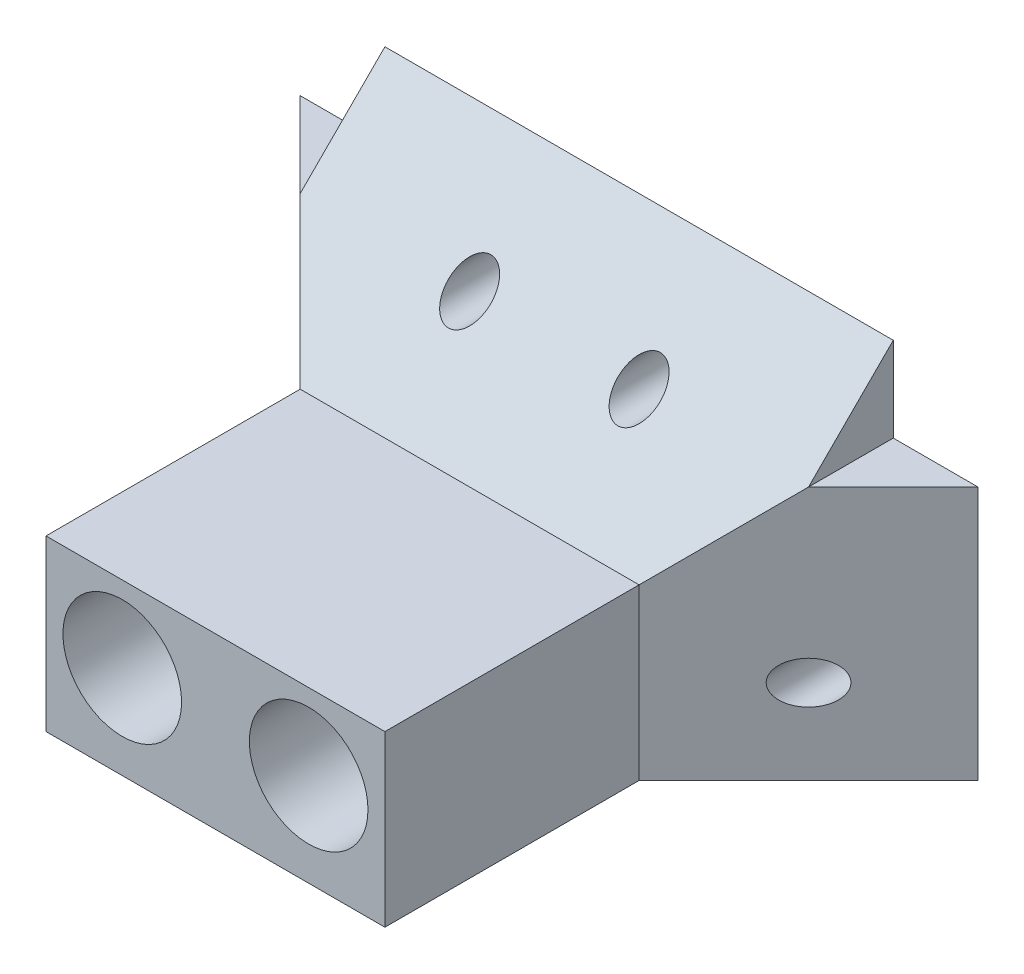
ISO-10303-21;
HEADER;
FILE_DESCRIPTION(('STEP AP214'),'2;1');
FILE_NAME('part.step','',(''),(''),'','','');
FILE_SCHEMA(('AUTOMOTIVE_DESIGN { 1 0 10303 214 1 1 1 1 }'));
ENDSEC;
DATA;
#1=APPLICATION_CONTEXT('core data for automotive mechanical design processes');
#2=APPLICATION_PROTOCOL_DEFINITION('international standard','automotive_design',2000,#1);
#3=PRODUCT_CONTEXT('',#1,'mechanical');
#4=PRODUCT('Part','Part','',(#3));
#5=PRODUCT_RELATED_PRODUCT_CATEGORY('part','',(#4));
#6=PRODUCT_DEFINITION_FORMATION('','',#4);
#7=PRODUCT_DEFINITION_CONTEXT('part definition',#1,'design');
#8=PRODUCT_DEFINITION('design','',#6,#7);
#9=PRODUCT_DEFINITION_SHAPE('','',#8);
#10=(LENGTH_UNIT() NAMED_UNIT(*) SI_UNIT(.MILLI.,.METRE.));
#11=(NAMED_UNIT(*) PLANE_ANGLE_UNIT() SI_UNIT($,.RADIAN.));
#12=(NAMED_UNIT(*) SI_UNIT($,.STERADIAN.) SOLID_ANGLE_UNIT());
#13=UNCERTAINTY_MEASURE_WITH_UNIT(LENGTH_MEASURE(1.E-05),#10,'distance_accuracy_value','');
#14=(GEOMETRIC_REPRESENTATION_CONTEXT(3) GLOBAL_UNCERTAINTY_ASSIGNED_CONTEXT((#13)) GLOBAL_UNIT_ASSIGNED_CONTEXT((#10,
#11,#12)) REPRESENTATION_CONTEXT('',''));
#15=CARTESIAN_POINT('',(0.,0.,0.));
#16=DIRECTION('',(0.,0.,1.));
#17=DIRECTION('',(1.,0.,0.));
#18=AXIS2_PLACEMENT_3D('',#15,#16,#17);
#19=CARTESIAN_POINT('',(14.9999999999999,20.0000000000001,15.));
#20=DIRECTION('',(0.,-0.707106781186547,-0.707106781186548));
#21=DIRECTION('',(0.,0.707106781186548,-0.707106781186547));
#22=AXIS2_PLACEMENT_3D('',#19,#20,#21);
#23=PLANE('',#22);
#24=CARTESIAN_POINT('',(4.99999999999995,15.,20.));
#25=DIRECTION('',(0.,-0.707106781186547,-0.707106781186548));
#26=DIRECTION('',(0.,0.707106781186548,-0.707106781186547));
#27=AXIS2_PLACEMENT_3D('',#24,#25,#26);
#28=ELLIPSE('',#27,1.76776695296637,1.25);
#29=CARTESIAN_POINT('',(4.99999999999994,16.25,18.75));
#30=VERTEX_POINT('',#29);
#31=EDGE_CURVE('E243',#30,#30,#28,.T.);
#32=ORIENTED_EDGE('',*,*,#31,.T.);
#33=EDGE_LOOP('',(#32));
#34=FACE_BOUND('',#33,.T.);
#35=CARTESIAN_POINT('',(-5.00000000000005,15.,20.));
#36=DIRECTION('',(0.,-0.707106781186547,-0.707106781186548));
#37=DIRECTION('',(0.,0.707106781186548,-0.707106781186547));
#38=AXIS2_PLACEMENT_3D('',#35,#36,#37);
#39=ELLIPSE('',#38,1.76776695296637,1.25);
#40=CARTESIAN_POINT('',(-5.00000000000005,16.25,18.75));
#41=VERTEX_POINT('',#40);
#42=EDGE_CURVE('E246',#41,#41,#39,.T.);
#43=ORIENTED_EDGE('',*,*,#42,.T.);
#44=EDGE_LOOP('',(#43));
#45=FACE_BOUND('',#44,.T.);
#46=DIRECTION('',(-0.577350269189624,-0.577350269189628,0.577350269189626));
#47=VECTOR('',#46,1.);
#48=CARTESIAN_POINT('',(18.3333333333332,18.3333333333334,16.6666666666667));
#49=LINE('',#48,#47);
#50=CARTESIAN_POINT('',(15.,15.,20.0000000000001));
#51=VERTEX_POINT('',#50);
#52=CARTESIAN_POINT('',(9.99999999999992,10.,25.));
#53=VERTEX_POINT('',#52);
#54=EDGE_CURVE('E547',#51,#53,#49,.T.);
#55=ORIENTED_EDGE('',*,*,#54,.F.);
#56=DIRECTION('',(0.,-0.707106781186548,0.707106781186547));
#57=VECTOR('',#56,1.);
#58=CARTESIAN_POINT('',(14.9999999999999,20.0000000000001,15.));
#59=LINE('',#58,#57);
#60=CARTESIAN_POINT('',(14.9999999999999,20.0000000000001,15.));
#61=VERTEX_POINT('',#60);
#62=EDGE_CURVE('E161',#61,#51,#59,.T.);
#63=ORIENTED_EDGE('',*,*,#62,.F.);
#64=DIRECTION('',(-1.,0.,0.));
#65=VECTOR('',#64,1.);
#66=CARTESIAN_POINT('',(-15.0000000000001,19.9999999999999,15.));
#67=LINE('',#66,#65);
#68=CARTESIAN_POINT('',(-15.0000000000001,20.,15.));
#69=VERTEX_POINT('',#68);
#70=EDGE_CURVE('E169',#61,#69,#67,.T.);
#71=ORIENTED_EDGE('',*,*,#70,.T.);
#72=DIRECTION('',(0.,-0.707106781186548,0.707106781186547));
#73=VECTOR('',#72,1.);
#74=CARTESIAN_POINT('',(-15.0000000000001,20.,15.));
#75=LINE('',#74,#73);
#76=CARTESIAN_POINT('',(-15.,15.,20.));
#77=VERTEX_POINT('',#76);
#78=EDGE_CURVE('E164',#69,#77,#75,.T.);
#79=ORIENTED_EDGE('',*,*,#78,.T.);
#80=DIRECTION('',(0.577350269189627,-0.577350269189625,0.577350269189626));
#81=VECTOR('',#80,1.);
#82=CARTESIAN_POINT('',(-8.33333333333337,8.33333333333334,26.6666666666666));
#83=LINE('',#82,#81);
#84=CARTESIAN_POINT('',(-10.,9.99999999999997,25.));
#85=VERTEX_POINT('',#84);
#86=EDGE_CURVE('E250',#77,#85,#83,.T.);
#87=ORIENTED_EDGE('',*,*,#86,.T.);
#88=DIRECTION('',(1.,0.,0.));
#89=VECTOR('',#88,1.);
#90=CARTESIAN_POINT('',(-15.,9.99999999999995,25.));
#91=LINE('',#90,#89);
#92=EDGE_CURVE('E168',#85,#53,#91,.T.);
#93=ORIENTED_EDGE('',*,*,#92,.T.);
#94=EDGE_LOOP('',(#55,#63,#71,#79,#87,#93));
#95=FACE_BOUND('',#94,.T.);
#96=ADVANCED_FACE('F41',(#34,#45,#95),#23,.F.);
#97=CARTESIAN_POINT('',(14.9999999999999,20.0000000000001,15.));
#98=DIRECTION('',(-1.,0.,0.));
#99=DIRECTION('',(0.,-1.,0.));
#100=AXIS2_PLACEMENT_3D('',#97,#98,#99);
#101=PLANE('',#100);
#102=DIRECTION('',(0.,-1.,0.));
#103=VECTOR('',#102,1.);
#104=CARTESIAN_POINT('',(14.9999999999999,20.0000000000001,15.));
#105=LINE('',#104,#103);
#106=CARTESIAN_POINT('',(14.9999999999999,15.,15.));
#107=VERTEX_POINT('',#106);
#108=EDGE_CURVE('E171',#61,#107,#105,.T.);
#109=ORIENTED_EDGE('',*,*,#108,.F.);
#110=ORIENTED_EDGE('',*,*,#62,.T.);
#111=DIRECTION('',(0.,0.,-1.));
#112=VECTOR('',#111,1.);
#113=CARTESIAN_POINT('',(14.9999999999999,15.,15.));
#114=LINE('',#113,#112);
#115=EDGE_CURVE('E179',#51,#107,#114,.T.);
#116=ORIENTED_EDGE('',*,*,#115,.T.);
#117=EDGE_LOOP('',(#109,#110,#116));
#118=FACE_BOUND('',#117,.T.);
#119=ADVANCED_FACE('F285',(#118),#101,.F.);
#120=CARTESIAN_POINT('',(-10.,10.,40.));
#121=DIRECTION('',(0.,-1.,0.));
#122=DIRECTION('',(0.,0.,-1.));
#123=AXIS2_PLACEMENT_3D('',#120,#121,#122);
#124=PLANE('',#123);
#125=ORIENTED_EDGE('',*,*,#92,.F.);
#126=DIRECTION('',(0.,0.,-1.));
#127=VECTOR('',#126,1.);
#128=CARTESIAN_POINT('',(-10.,10.,40.));
#129=LINE('',#128,#127);
#130=CARTESIAN_POINT('',(-10.,10.,40.));
#131=VERTEX_POINT('',#130);
#132=EDGE_CURVE('E231',#131,#85,#129,.T.);
#133=ORIENTED_EDGE('',*,*,#132,.F.);
#134=DIRECTION('',(-1.,0.,0.));
#135=VECTOR('',#134,1.);
#136=CARTESIAN_POINT('',(-10.,10.,40.));
#137=LINE('',#136,#135);
#138=CARTESIAN_POINT('',(10.,10.,40.));
#139=VERTEX_POINT('',#138);
#140=EDGE_CURVE('E63',#139,#131,#137,.T.);
#141=ORIENTED_EDGE('',*,*,#140,.F.);
#142=DIRECTION('',(0.,0.,-1.));
#143=VECTOR('',#142,1.);
#144=CARTESIAN_POINT('',(10.,10.,40.));
#145=LINE('',#144,#143);
#146=EDGE_CURVE('E234',#139,#53,#145,.T.);
#147=ORIENTED_EDGE('',*,*,#146,.T.);
#148=EDGE_LOOP('',(#125,#133,#141,#147));
#149=FACE_BOUND('',#148,.T.);
#150=ADVANCED_FACE('F290',(#149),#124,.F.);
#151=CARTESIAN_POINT('',(-10.,10.,40.));
#152=DIRECTION('',(1.,0.,0.));
#153=DIRECTION('',(0.,0.,-1.));
#154=AXIS2_PLACEMENT_3D('',#151,#152,#153);
#155=PLANE('',#154);
#156=DIRECTION('',(0.,1.,0.));
#157=VECTOR('',#156,1.);
#158=CARTESIAN_POINT('',(-10.,-15.,25.));
#159=LINE('',#158,#157);
#160=CARTESIAN_POINT('',(-10.,0.,25.));
#161=VERTEX_POINT('',#160);
#162=EDGE_CURVE('E157',#161,#85,#159,.T.);
#163=ORIENTED_EDGE('',*,*,#162,.F.);
#164=DIRECTION('',(0.,0.,1.));
#165=VECTOR('',#164,1.);
#166=CARTESIAN_POINT('',(-10.,0.,40.));
#167=LINE('',#166,#165);
#168=CARTESIAN_POINT('',(-10.,0.,40.));
#169=VERTEX_POINT('',#168);
#170=EDGE_CURVE('E56',#161,#169,#167,.T.);
#171=ORIENTED_EDGE('',*,*,#170,.T.);
#172=DIRECTION('',(0.,-1.,0.));
#173=VECTOR('',#172,1.);
#174=CARTESIAN_POINT('',(-10.,10.,40.));
#175=LINE('',#174,#173);
#176=EDGE_CURVE('E229',#131,#169,#175,.T.);
#177=ORIENTED_EDGE('',*,*,#176,.F.);
#178=ORIENTED_EDGE('',*,*,#132,.T.);
#179=EDGE_LOOP('',(#163,#171,#177,#178));
#180=FACE_BOUND('',#179,.T.);
#181=ADVANCED_FACE('F414',(#180),#155,.F.);
#182=CARTESIAN_POINT('',(20.,15.,15.));
#183=DIRECTION('',(0.,-1.,0.));
#184=DIRECTION('',(1.,0.,0.));
#185=AXIS2_PLACEMENT_3D('',#182,#183,#184);
#186=PLANE('',#185);
#187=ORIENTED_EDGE('',*,*,#115,.F.);
#188=DIRECTION('',(-0.707106781186548,0.,0.707106781186547));
#189=VECTOR('',#188,1.);
#190=CARTESIAN_POINT('',(20.,15.,15.));
#191=LINE('',#190,#189);
#192=CARTESIAN_POINT('',(20.,15.,15.));
#193=VERTEX_POINT('',#192);
#194=EDGE_CURVE('E185',#193,#51,#191,.T.);
#195=ORIENTED_EDGE('',*,*,#194,.F.);
#196=DIRECTION('',(-1.,0.,0.));
#197=VECTOR('',#196,1.);
#198=CARTESIAN_POINT('',(20.,15.,15.));
#199=LINE('',#198,#197);
#200=EDGE_CURVE('E190',#193,#107,#199,.T.);
#201=ORIENTED_EDGE('',*,*,#200,.T.);
#202=EDGE_LOOP('',(#187,#195,#201));
#203=FACE_BOUND('',#202,.T.);
#204=ADVANCED_FACE('F406',(#203),#186,.F.);
#205=CARTESIAN_POINT('',(20.,-15.,15.));
#206=DIRECTION('',(-0.707106781186547,0.,-0.707106781186548));
#207=DIRECTION('',(-0.707106781186548,0.,0.707106781186547));
#208=AXIS2_PLACEMENT_3D('',#205,#206,#207);
#209=PLANE('',#208);
#210=CARTESIAN_POINT('',(15.,5.,20.));
#211=DIRECTION('',(-0.707106781186547,0.,-0.707106781186548));
#212=DIRECTION('',(0.707106781186548,0.,-0.707106781186547));
#213=AXIS2_PLACEMENT_3D('',#210,#211,#212);
#214=ELLIPSE('',#213,1.76776695296637,1.25);
#215=CARTESIAN_POINT('',(16.25,5.,18.75));
#216=VERTEX_POINT('',#215);
#217=EDGE_CURVE('E184',#216,#216,#214,.T.);
#218=ORIENTED_EDGE('',*,*,#217,.T.);
#219=EDGE_LOOP('',(#218));
#220=FACE_BOUND('',#219,.T.);
#221=DIRECTION('',(0.,-1.,0.));
#222=VECTOR('',#221,1.);
#223=CARTESIAN_POINT('',(10.,15.,25.));
#224=LINE('',#223,#222);
#225=CARTESIAN_POINT('',(10.,0.,25.));
#226=VERTEX_POINT('',#225);
#227=EDGE_CURVE('E49',#53,#226,#224,.T.);
#228=ORIENTED_EDGE('',*,*,#227,.T.);
#229=DIRECTION('',(0.707106781186548,0.,-0.707106781186547));
#230=VECTOR('',#229,1.);
#231=CARTESIAN_POINT('',(20.,0.,15.));
#232=LINE('',#231,#230);
#233=CARTESIAN_POINT('',(20.,0.,15.));
#234=VERTEX_POINT('',#233);
#235=EDGE_CURVE('E548',#226,#234,#232,.T.);
#236=ORIENTED_EDGE('',*,*,#235,.T.);
#237=DIRECTION('',(0.,1.,0.));
#238=VECTOR('',#237,1.);
#239=CARTESIAN_POINT('',(20.,15.,15.));
#240=LINE('',#239,#238);
#241=EDGE_CURVE('E188',#234,#193,#240,.T.);
#242=ORIENTED_EDGE('',*,*,#241,.T.);
#243=ORIENTED_EDGE('',*,*,#194,.T.);
#244=ORIENTED_EDGE('',*,*,#54,.T.);
#245=EDGE_LOOP('',(#228,#236,#242,#243,#244));
#246=FACE_BOUND('',#245,.T.);
#247=ADVANCED_FACE('F397',(#220,#246),#209,.F.);
#248=CARTESIAN_POINT('',(10.,10.,40.));
#249=DIRECTION('',(-1.,0.,0.));
#250=DIRECTION('',(0.,-1.,0.));
#251=AXIS2_PLACEMENT_3D('',#248,#249,#250);
#252=PLANE('',#251);
#253=DIRECTION('',(0.,1.,0.));
#254=VECTOR('',#253,1.);
#255=CARTESIAN_POINT('',(10.,10.,40.));
#256=LINE('',#255,#254);
#257=CARTESIAN_POINT('',(10.,0.,40.));
#258=VERTEX_POINT('',#257);
#259=EDGE_CURVE('E226',#258,#139,#256,.T.);
#260=ORIENTED_EDGE('',*,*,#259,.F.);
#261=DIRECTION('',(0.,0.,-1.));
#262=VECTOR('',#261,1.);
#263=CARTESIAN_POINT('',(10.,0.,40.));
#264=LINE('',#263,#262);
#265=EDGE_CURVE('E551',#258,#226,#264,.T.);
#266=ORIENTED_EDGE('',*,*,#265,.T.);
#267=ORIENTED_EDGE('',*,*,#227,.F.);
#268=ORIENTED_EDGE('',*,*,#146,.F.);
#269=EDGE_LOOP('',(#260,#266,#267,#268));
#270=FACE_BOUND('',#269,.T.);
#271=ADVANCED_FACE('F43',(#270),#252,.F.);
#272=CARTESIAN_POINT('',(2.92893218813453,0.,0.));
#273=DIRECTION('',(1.,0.,0.));
#274=DIRECTION('',(0.,0.,-1.));
#275=AXIS2_PLACEMENT_3D('',#272,#273,#274);
#276=PLANE('',#275);
#277=DIRECTION('',(0.,0.,1.));
#278=VECTOR('',#277,1.);
#279=CARTESIAN_POINT('',(2.92893218813453,0.,0.));
#280=LINE('',#279,#278);
#281=CARTESIAN_POINT('',(2.92893218813453,0.,10.));
#282=VERTEX_POINT('',#281);
#283=CARTESIAN_POINT('',(2.92893218813453,0.,15.));
#284=VERTEX_POINT('',#283);
#285=EDGE_CURVE('E541',#282,#284,#280,.T.);
#286=ORIENTED_EDGE('',*,*,#285,.F.);
#287=DIRECTION('',(0.,-1.,0.));
#288=VECTOR('',#287,1.);
#289=CARTESIAN_POINT('',(2.92893218813453,2.92893218813454,10.));
#290=LINE('',#289,#288);
#291=CARTESIAN_POINT('',(2.92893218813453,2.92893218813454,10.));
#292=VERTEX_POINT('',#291);
#293=EDGE_CURVE('E196',#292,#282,#290,.T.);
#294=ORIENTED_EDGE('',*,*,#293,.F.);
#295=DIRECTION('',(0.,0.,1.));
#296=VECTOR('',#295,1.);
#297=CARTESIAN_POINT('',(2.92893218813453,2.92893218813454,0.));
#298=LINE('',#297,#296);
#299=CARTESIAN_POINT('',(2.92893218813453,2.92893218813454,15.));
#300=VERTEX_POINT('',#299);
#301=EDGE_CURVE('E193',#292,#300,#298,.T.);
#302=ORIENTED_EDGE('',*,*,#301,.T.);
#303=DIRECTION('',(0.,-1.,0.));
#304=VECTOR('',#303,1.);
#305=CARTESIAN_POINT('',(2.92893218813453,7.5,15.));
#306=LINE('',#305,#304);
#307=EDGE_CURVE('E223',#300,#284,#306,.T.);
#308=ORIENTED_EDGE('',*,*,#307,.T.);
#309=EDGE_LOOP('',(#286,#294,#302,#308));
#310=FACE_BOUND('',#309,.T.);
#311=ADVANCED_FACE('F384',(#310),#276,.T.);
#312=CARTESIAN_POINT('',(0.,2.92893218813453,0.));
#313=DIRECTION('',(0.,1.,0.));
#314=DIRECTION('',(0.,0.,-1.));
#315=AXIS2_PLACEMENT_3D('',#312,#313,#314);
#316=PLANE('',#315);
#317=ORIENTED_EDGE('',*,*,#301,.F.);
#318=DIRECTION('',(1.,0.,0.));
#319=VECTOR('',#318,1.);
#320=CARTESIAN_POINT('',(2.92893218813453,2.92893218813454,10.));
#321=LINE('',#320,#319);
#322=CARTESIAN_POINT('',(-2.92893218813453,2.92893218813454,10.));
#323=VERTEX_POINT('',#322);
#324=EDGE_CURVE('E199',#323,#292,#321,.T.);
#325=ORIENTED_EDGE('',*,*,#324,.F.);
#326=DIRECTION('',(0.,0.,1.));
#327=VECTOR('',#326,1.);
#328=CARTESIAN_POINT('',(-2.92893218813453,2.92893218813452,0.));
#329=LINE('',#328,#327);
#330=CARTESIAN_POINT('',(-2.92893218813453,2.92893218813452,15.));
#331=VERTEX_POINT('',#330);
#332=EDGE_CURVE('E220',#323,#331,#329,.T.);
#333=ORIENTED_EDGE('',*,*,#332,.T.);
#334=DIRECTION('',(1.,0.,0.));
#335=VECTOR('',#334,1.);
#336=CARTESIAN_POINT('',(-7.50000000000001,2.9289321881345,15.));
#337=LINE('',#336,#335);
#338=EDGE_CURVE('E217',#331,#300,#337,.T.);
#339=ORIENTED_EDGE('',*,*,#338,.T.);
#340=EDGE_LOOP('',(#317,#325,#333,#339));
#341=FACE_BOUND('',#340,.T.);
#342=ADVANCED_FACE('F375',(#341),#316,.T.);
#343=CARTESIAN_POINT('',(-2.92893218813453,0.,0.));
#344=DIRECTION('',(-1.,0.,0.));
#345=DIRECTION('',(0.,0.,-1.));
#346=AXIS2_PLACEMENT_3D('',#343,#344,#345);
#347=PLANE('',#346);
#348=DIRECTION('',(0.,0.,-1.));
#349=VECTOR('',#348,1.);
#350=CARTESIAN_POINT('',(-2.92893218813453,0.,0.));
#351=LINE('',#350,#349);
#352=CARTESIAN_POINT('',(-2.92893218813453,0.,15.));
#353=VERTEX_POINT('',#352);
#354=CARTESIAN_POINT('',(-2.92893218813453,0.,10.));
#355=VERTEX_POINT('',#354);
#356=EDGE_CURVE('E149',#353,#355,#351,.T.);
#357=ORIENTED_EDGE('',*,*,#356,.F.);
#358=DIRECTION('',(0.,1.,0.));
#359=VECTOR('',#358,1.);
#360=CARTESIAN_POINT('',(-2.92893218813453,-7.5,15.));
#361=LINE('',#360,#359);
#362=EDGE_CURVE('E148',#353,#331,#361,.T.);
#363=ORIENTED_EDGE('',*,*,#362,.T.);
#364=ORIENTED_EDGE('',*,*,#332,.F.);
#365=DIRECTION('',(0.,-1.,0.));
#366=VECTOR('',#365,1.);
#367=CARTESIAN_POINT('',(-2.92893218813453,0.,10.));
#368=LINE('',#367,#366);
#369=EDGE_CURVE('E201',#323,#355,#368,.T.);
#370=ORIENTED_EDGE('',*,*,#369,.T.);
#371=EDGE_LOOP('',(#357,#363,#364,#370));
#372=FACE_BOUND('',#371,.T.);
#373=ADVANCED_FACE('F364',(#372),#347,.T.);
#374=CARTESIAN_POINT('',(0.,0.,40.));
#375=DIRECTION('',(0.,0.,1.));
#376=DIRECTION('',(1.,0.,0.));
#377=AXIS2_PLACEMENT_3D('',#374,#375,#376);
#378=PLANE('',#377);
#379=DIRECTION('',(-1.,0.,0.));
#380=VECTOR('',#379,1.);
#381=CARTESIAN_POINT('',(0.,0.,40.));
#382=LINE('',#381,#380);
#383=EDGE_CURVE('E557',#258,#169,#382,.T.);
#384=ORIENTED_EDGE('',*,*,#383,.F.);
#385=ORIENTED_EDGE('',*,*,#259,.T.);
#386=ORIENTED_EDGE('',*,*,#140,.T.);
#387=ORIENTED_EDGE('',*,*,#176,.T.);
#388=EDGE_LOOP('',(#384,#385,#386,#387));
#389=FACE_BOUND('',#388,.T.);
#390=CARTESIAN_POINT('',(5.5,5.5,40.));
#391=DIRECTION('',(0.,0.,1.));
#392=DIRECTION('',(1.,0.,0.));
#393=AXIS2_PLACEMENT_3D('',#390,#391,#392);
#394=CIRCLE('',#393,3.5);
#395=CARTESIAN_POINT('',(9.,5.5,40.));
#396=VERTEX_POINT('',#395);
#397=EDGE_CURVE('E205',#396,#396,#394,.T.);
#398=ORIENTED_EDGE('',*,*,#397,.F.);
#399=EDGE_LOOP('',(#398));
#400=FACE_BOUND('',#399,.T.);
#401=CARTESIAN_POINT('',(-5.5,5.5,40.));
#402=DIRECTION('',(0.,0.,1.));
#403=DIRECTION('',(1.,0.,0.));
#404=AXIS2_PLACEMENT_3D('',#401,#402,#403);
#405=CIRCLE('',#404,3.5);
#406=CARTESIAN_POINT('',(-2.,5.5,40.));
#407=VERTEX_POINT('',#406);
#408=EDGE_CURVE('E208',#407,#407,#405,.T.);
#409=ORIENTED_EDGE('',*,*,#408,.F.);
#410=EDGE_LOOP('',(#409));
#411=FACE_BOUND('',#410,.T.);
#412=ADVANCED_FACE('F351',(#389,#400,#411),#378,.T.);
#413=CARTESIAN_POINT('',(2.92893218813453,7.5,15.));
#414=DIRECTION('',(0.,0.,1.));
#415=DIRECTION('',(0.,-1.,0.));
#416=AXIS2_PLACEMENT_3D('',#413,#414,#415);
#417=PLANE('',#416);
#418=CARTESIAN_POINT('',(-15.,5.,15.));
#419=DIRECTION('',(0.,0.,-1.));
#420=DIRECTION('',(0.,-1.,0.));
#421=AXIS2_PLACEMENT_3D('',#418,#419,#420);
#422=CIRCLE('',#421,1.25);
#423=CARTESIAN_POINT('',(-15.,3.75,15.));
#424=VERTEX_POINT('',#423);
#425=EDGE_CURVE('E549',#424,#424,#422,.T.);
#426=ORIENTED_EDGE('',*,*,#425,.F.);
#427=EDGE_LOOP('',(#426));
#428=FACE_BOUND('',#427,.T.);
#429=CARTESIAN_POINT('',(-5.00000000000005,15.,15.));
#430=DIRECTION('',(0.,0.,-1.));
#431=DIRECTION('',(-1.,0.,0.));
#432=AXIS2_PLACEMENT_3D('',#429,#430,#431);
#433=CIRCLE('',#432,1.25);
#434=CARTESIAN_POINT('',(-6.25000000000005,15.,15.));
#435=VERTEX_POINT('',#434);
#436=EDGE_CURVE('E562',#435,#435,#433,.T.);
#437=ORIENTED_EDGE('',*,*,#436,.F.);
#438=EDGE_LOOP('',(#437));
#439=FACE_BOUND('',#438,.T.);
#440=CARTESIAN_POINT('',(4.99999999999995,15.,15.));
#441=DIRECTION('',(0.,0.,-1.));
#442=DIRECTION('',(-1.,0.,0.));
#443=AXIS2_PLACEMENT_3D('',#440,#441,#442);
#444=CIRCLE('',#443,1.25);
#445=CARTESIAN_POINT('',(3.74999999999995,15.,15.));
#446=VERTEX_POINT('',#445);
#447=EDGE_CURVE('E244',#446,#446,#444,.T.);
#448=ORIENTED_EDGE('',*,*,#447,.F.);
#449=EDGE_LOOP('',(#448));
#450=FACE_BOUND('',#449,.T.);
#451=CARTESIAN_POINT('',(15.,5.,15.));
#452=DIRECTION('',(0.,0.,-1.));
#453=DIRECTION('',(0.,1.,0.));
#454=AXIS2_PLACEMENT_3D('',#451,#452,#453);
#455=CIRCLE('',#454,1.25);
#456=CARTESIAN_POINT('',(15.,6.25,15.));
#457=VERTEX_POINT('',#456);
#458=EDGE_CURVE('E181',#457,#457,#455,.T.);
#459=ORIENTED_EDGE('',*,*,#458,.F.);
#460=EDGE_LOOP('',(#459));
#461=FACE_BOUND('',#460,.T.);
#462=CARTESIAN_POINT('',(5.5,5.5,15.));
#463=DIRECTION('',(0.,0.,1.));
#464=DIRECTION('',(1.,0.,0.));
#465=AXIS2_PLACEMENT_3D('',#462,#463,#464);
#466=CIRCLE('',#465,3.5);
#467=CARTESIAN_POINT('',(9.,5.5,15.));
#468=VERTEX_POINT('',#467);
#469=EDGE_CURVE('E204',#468,#468,#466,.T.);
#470=ORIENTED_EDGE('',*,*,#469,.T.);
#471=EDGE_LOOP('',(#470));
#472=FACE_BOUND('',#471,.T.);
#473=CARTESIAN_POINT('',(-5.5,5.5,15.));
#474=DIRECTION('',(0.,0.,1.));
#475=DIRECTION('',(1.,0.,0.));
#476=AXIS2_PLACEMENT_3D('',#473,#474,#475);
#477=CIRCLE('',#476,3.5);
#478=CARTESIAN_POINT('',(-2.,5.5,15.));
#479=VERTEX_POINT('',#478);
#480=EDGE_CURVE('E211',#479,#479,#477,.T.);
#481=ORIENTED_EDGE('',*,*,#480,.T.);
#482=EDGE_LOOP('',(#481));
#483=FACE_BOUND('',#482,.T.);
#484=ORIENTED_EDGE('',*,*,#241,.F.);
#485=DIRECTION('',(-1.,0.,0.));
#486=VECTOR('',#485,1.);
#487=CARTESIAN_POINT('',(2.92893218813453,0.,15.));
#488=LINE('',#487,#486);
#489=EDGE_CURVE('E151',#234,#284,#488,.T.);
#490=ORIENTED_EDGE('',*,*,#489,.T.);
#491=ORIENTED_EDGE('',*,*,#307,.F.);
#492=ORIENTED_EDGE('',*,*,#338,.F.);
#493=ORIENTED_EDGE('',*,*,#362,.F.);
#494=CARTESIAN_POINT('',(-20.,0.,15.));
#495=VERTEX_POINT('',#494);
#496=EDGE_CURVE('E135',#353,#495,#488,.T.);
#497=ORIENTED_EDGE('',*,*,#496,.T.);
#498=DIRECTION('',(0.,-1.,0.));
#499=VECTOR('',#498,1.);
#500=CARTESIAN_POINT('',(-20.,-15.,15.));
#501=LINE('',#500,#499);
#502=CARTESIAN_POINT('',(-20.,15.,15.));
#503=VERTEX_POINT('',#502);
#504=EDGE_CURVE('E146',#503,#495,#501,.T.);
#505=ORIENTED_EDGE('',*,*,#504,.F.);
#506=DIRECTION('',(1.,0.,0.));
#507=VECTOR('',#506,1.);
#508=CARTESIAN_POINT('',(-20.,15.,15.));
#509=LINE('',#508,#507);
#510=CARTESIAN_POINT('',(-15.0000000000001,15.,15.));
#511=VERTEX_POINT('',#510);
#512=EDGE_CURVE('E156',#503,#511,#509,.T.);
#513=ORIENTED_EDGE('',*,*,#512,.T.);
#514=DIRECTION('',(0.,-1.,0.));
#515=VECTOR('',#514,1.);
#516=CARTESIAN_POINT('',(-15.0000000000001,19.9999999999999,15.));
#517=LINE('',#516,#515);
#518=EDGE_CURVE('E176',#69,#511,#517,.T.);
#519=ORIENTED_EDGE('',*,*,#518,.F.);
#520=ORIENTED_EDGE('',*,*,#70,.F.);
#521=ORIENTED_EDGE('',*,*,#108,.T.);
#522=ORIENTED_EDGE('',*,*,#200,.F.);
#523=EDGE_LOOP('',(#484,#490,#491,#492,#493,#497,#505,#513,#519,#520,#521,#522));
#524=FACE_BOUND('',#523,.T.);
#525=ADVANCED_FACE('F144',(#428,#439,#450,#461,#472,#483,#524),#417,.F.);
#526=CARTESIAN_POINT('',(-5.5,5.5,15.));
#527=DIRECTION('',(0.,0.,1.));
#528=DIRECTION('',(0.,-1.,0.));
#529=AXIS2_PLACEMENT_3D('',#526,#527,#528);
#530=CYLINDRICAL_SURFACE('',#529,3.5);
#531=ORIENTED_EDGE('',*,*,#480,.F.);
#532=EDGE_LOOP('',(#531));
#533=FACE_BOUND('',#532,.T.);
#534=ORIENTED_EDGE('',*,*,#408,.T.);
#535=EDGE_LOOP('',(#534));
#536=FACE_BOUND('',#535,.T.);
#537=ADVANCED_FACE('F350',(#533,#536),#530,.F.);
#538=CARTESIAN_POINT('',(5.5,5.5,15.));
#539=DIRECTION('',(0.,0.,1.));
#540=DIRECTION('',(0.,-1.,0.));
#541=AXIS2_PLACEMENT_3D('',#538,#539,#540);
#542=CYLINDRICAL_SURFACE('',#541,3.5);
#543=ORIENTED_EDGE('',*,*,#469,.F.);
#544=EDGE_LOOP('',(#543));
#545=FACE_BOUND('',#544,.T.);
#546=ORIENTED_EDGE('',*,*,#397,.T.);
#547=EDGE_LOOP('',(#546));
#548=FACE_BOUND('',#547,.T.);
#549=ADVANCED_FACE('F335',(#545,#548),#542,.F.);
#550=CARTESIAN_POINT('',(0.,0.,10.));
#551=DIRECTION('',(0.,0.,-1.));
#552=DIRECTION('',(-1.,0.,0.));
#553=AXIS2_PLACEMENT_3D('',#550,#551,#552);
#554=PLANE('',#553);
#555=DIRECTION('',(1.,0.,0.));
#556=VECTOR('',#555,1.);
#557=CARTESIAN_POINT('',(0.,0.,10.));
#558=LINE('',#557,#556);
#559=EDGE_CURVE('E543',#355,#282,#558,.T.);
#560=ORIENTED_EDGE('',*,*,#559,.F.);
#561=ORIENTED_EDGE('',*,*,#369,.F.);
#562=ORIENTED_EDGE('',*,*,#324,.T.);
#563=ORIENTED_EDGE('',*,*,#293,.T.);
#564=EDGE_LOOP('',(#560,#561,#562,#563));
#565=FACE_BOUND('',#564,.T.);
#566=ADVANCED_FACE('F330',(#565),#554,.T.);
#567=CARTESIAN_POINT('',(15.,5.,25.));
#568=DIRECTION('',(0.,0.,-1.));
#569=DIRECTION('',(0.,1.,0.));
#570=AXIS2_PLACEMENT_3D('',#567,#568,#569);
#571=CYLINDRICAL_SURFACE('',#570,1.25);
#572=ORIENTED_EDGE('',*,*,#458,.T.);
#573=EDGE_LOOP('',(#572));
#574=FACE_BOUND('',#573,.T.);
#575=ORIENTED_EDGE('',*,*,#217,.F.);
#576=EDGE_LOOP('',(#575));
#577=FACE_BOUND('',#576,.T.);
#578=ADVANCED_FACE('F280',(#574,#577),#571,.F.);
#579=CARTESIAN_POINT('',(-15.0000000000001,19.9999999999999,15.));
#580=DIRECTION('',(1.,0.,0.));
#581=DIRECTION('',(0.,1.,0.));
#582=AXIS2_PLACEMENT_3D('',#579,#580,#581);
#583=PLANE('',#582);
#584=DIRECTION('',(0.,0.,-1.));
#585=VECTOR('',#584,1.);
#586=CARTESIAN_POINT('',(-15.0000000000001,15.,15.));
#587=LINE('',#586,#585);
#588=EDGE_CURVE('E159',#77,#511,#587,.T.);
#589=ORIENTED_EDGE('',*,*,#588,.F.);
#590=ORIENTED_EDGE('',*,*,#78,.F.);
#591=ORIENTED_EDGE('',*,*,#518,.T.);
#592=EDGE_LOOP('',(#589,#590,#591));
#593=FACE_BOUND('',#592,.T.);
#594=ADVANCED_FACE('F269',(#593),#583,.F.);
#595=CARTESIAN_POINT('',(-20.,15.,15.));
#596=DIRECTION('',(0.,-1.,0.));
#597=DIRECTION('',(0.,0.,-1.));
#598=AXIS2_PLACEMENT_3D('',#595,#596,#597);
#599=PLANE('',#598);
#600=ORIENTED_EDGE('',*,*,#512,.F.);
#601=DIRECTION('',(0.707106781186548,0.,0.707106781186547));
#602=VECTOR('',#601,1.);
#603=CARTESIAN_POINT('',(-20.,15.,15.));
#604=LINE('',#603,#602);
#605=EDGE_CURVE('E154',#503,#77,#604,.T.);
#606=ORIENTED_EDGE('',*,*,#605,.T.);
#607=ORIENTED_EDGE('',*,*,#588,.T.);
#608=EDGE_LOOP('',(#600,#606,#607));
#609=FACE_BOUND('',#608,.T.);
#610=ADVANCED_FACE('F270',(#609),#599,.F.);
#611=CARTESIAN_POINT('',(-20.,15.,15.));
#612=DIRECTION('',(0.707106781186547,0.,-0.707106781186548));
#613=DIRECTION('',(-0.707106781186548,0.,-0.707106781186547));
#614=AXIS2_PLACEMENT_3D('',#611,#612,#613);
#615=PLANE('',#614);
#616=CARTESIAN_POINT('',(-15.,5.,20.));
#617=DIRECTION('',(0.707106781186547,0.,-0.707106781186548));
#618=DIRECTION('',(-0.707106781186548,0.,-0.707106781186547));
#619=AXIS2_PLACEMENT_3D('',#616,#617,#618);
#620=ELLIPSE('',#619,1.76776695296637,1.25);
#621=CARTESIAN_POINT('',(-16.25,5.,18.75));
#622=VERTEX_POINT('',#621);
#623=EDGE_CURVE('E240',#622,#622,#620,.T.);
#624=ORIENTED_EDGE('',*,*,#623,.T.);
#625=EDGE_LOOP('',(#624));
#626=FACE_BOUND('',#625,.T.);
#627=ORIENTED_EDGE('',*,*,#504,.T.);
#628=DIRECTION('',(0.707106781186548,0.,0.707106781186547));
#629=VECTOR('',#628,1.);
#630=CARTESIAN_POINT('',(-20.,0.,15.));
#631=LINE('',#630,#629);
#632=EDGE_CURVE('E11',#495,#161,#631,.T.);
#633=ORIENTED_EDGE('',*,*,#632,.T.);
#634=ORIENTED_EDGE('',*,*,#162,.T.);
#635=ORIENTED_EDGE('',*,*,#86,.F.);
#636=ORIENTED_EDGE('',*,*,#605,.F.);
#637=EDGE_LOOP('',(#627,#633,#634,#635,#636));
#638=FACE_BOUND('',#637,.T.);
#639=ADVANCED_FACE('F152',(#626,#638),#615,.F.);
#640=CARTESIAN_POINT('',(-15.,5.,25.));
#641=DIRECTION('',(0.,0.,-1.));
#642=DIRECTION('',(0.,1.,0.));
#643=AXIS2_PLACEMENT_3D('',#640,#641,#642);
#644=CYLINDRICAL_SURFACE('',#643,1.25);
#645=ORIENTED_EDGE('',*,*,#425,.T.);
#646=EDGE_LOOP('',(#645));
#647=FACE_BOUND('',#646,.T.);
#648=ORIENTED_EDGE('',*,*,#623,.F.);
#649=EDGE_LOOP('',(#648));
#650=FACE_BOUND('',#649,.T.);
#651=ADVANCED_FACE('F277',(#647,#650),#644,.F.);
#652=CARTESIAN_POINT('',(4.99999999999995,15.,25.));
#653=DIRECTION('',(0.,0.,-1.));
#654=DIRECTION('',(-1.,0.,0.));
#655=AXIS2_PLACEMENT_3D('',#652,#653,#654);
#656=CYLINDRICAL_SURFACE('',#655,1.25);
#657=ORIENTED_EDGE('',*,*,#447,.T.);
#658=EDGE_LOOP('',(#657));
#659=FACE_BOUND('',#658,.T.);
#660=ORIENTED_EDGE('',*,*,#31,.F.);
#661=EDGE_LOOP('',(#660));
#662=FACE_BOUND('',#661,.T.);
#663=ADVANCED_FACE('F292',(#659,#662),#656,.F.);
#664=CARTESIAN_POINT('',(-5.00000000000005,15.,25.));
#665=DIRECTION('',(0.,0.,-1.));
#666=DIRECTION('',(-1.,0.,0.));
#667=AXIS2_PLACEMENT_3D('',#664,#665,#666);
#668=CYLINDRICAL_SURFACE('',#667,1.25);
#669=ORIENTED_EDGE('',*,*,#436,.T.);
#670=EDGE_LOOP('',(#669));
#671=FACE_BOUND('',#670,.T.);
#672=ORIENTED_EDGE('',*,*,#42,.F.);
#673=EDGE_LOOP('',(#672));
#674=FACE_BOUND('',#673,.T.);
#675=ADVANCED_FACE('F295',(#671,#674),#668,.F.);
#676=CARTESIAN_POINT('',(0.,0.,0.));
#677=DIRECTION('',(0.,1.,0.));
#678=DIRECTION('',(0.,0.,1.));
#679=AXIS2_PLACEMENT_3D('',#676,#677,#678);
#680=PLANE('',#679);
#681=ORIENTED_EDGE('',*,*,#235,.F.);
#682=ORIENTED_EDGE('',*,*,#265,.F.);
#683=ORIENTED_EDGE('',*,*,#383,.T.);
#684=ORIENTED_EDGE('',*,*,#170,.F.);
#685=ORIENTED_EDGE('',*,*,#632,.F.);
#686=ORIENTED_EDGE('',*,*,#496,.F.);
#687=ORIENTED_EDGE('',*,*,#356,.T.);
#688=ORIENTED_EDGE('',*,*,#559,.T.);
#689=ORIENTED_EDGE('',*,*,#285,.T.);
#690=ORIENTED_EDGE('',*,*,#489,.F.);
#691=EDGE_LOOP('',(#681,#682,#683,#684,#685,#686,#687,#688,#689,#690));
#692=FACE_BOUND('',#691,.T.);
#693=ADVANCED_FACE('F134',(#692),#680,.F.);
#694=CLOSED_SHELL('',(#96,#119,#150,#181,#204,#247,#271,#311,#342,#373,#412,#525,#537,#549,#566,
#578,#594,#610,#639,#651,#663,#675,#693));
#695=MANIFOLD_SOLID_BREP('B2',#694);
#696=ADVANCED_BREP_SHAPE_REPRESENTATION('',(#18,#695),#14);
#697=SHAPE_DEFINITION_REPRESENTATION(#9,#696);
ENDSEC;
END-ISO-10303-21;
